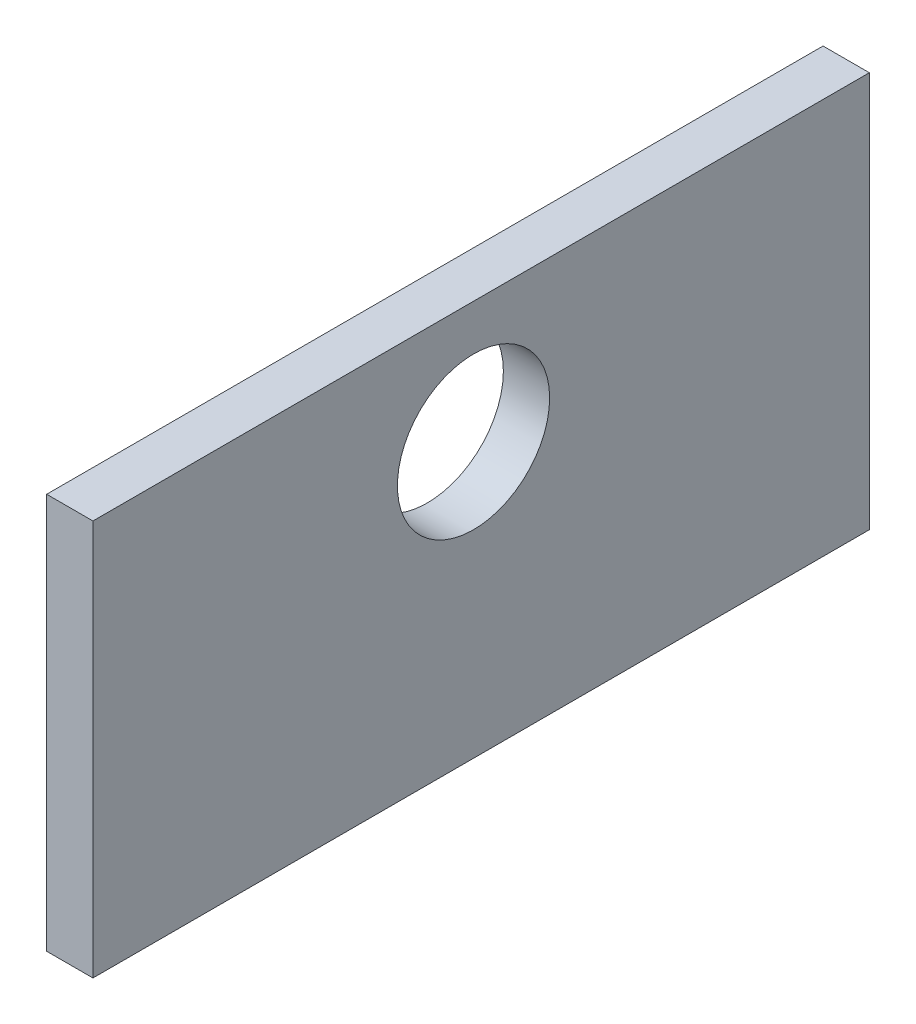
ISO-10303-21;
HEADER;
FILE_DESCRIPTION(('STEP AP214'),'2;1');
FILE_NAME('part.step','',(''),(''),'','','');
FILE_SCHEMA(('AUTOMOTIVE_DESIGN { 1 0 10303 214 1 1 1 1 }'));
ENDSEC;
DATA;
#1=APPLICATION_CONTEXT('core data for automotive mechanical design processes');
#2=APPLICATION_PROTOCOL_DEFINITION('international standard','automotive_design',2000,#1);
#3=PRODUCT_CONTEXT('',#1,'mechanical');
#4=PRODUCT('Part','Part','',(#3));
#5=PRODUCT_RELATED_PRODUCT_CATEGORY('part','',(#4));
#6=PRODUCT_DEFINITION_FORMATION('','',#4);
#7=PRODUCT_DEFINITION_CONTEXT('part definition',#1,'design');
#8=PRODUCT_DEFINITION('design','',#6,#7);
#9=PRODUCT_DEFINITION_SHAPE('','',#8);
#10=(LENGTH_UNIT() NAMED_UNIT(*) SI_UNIT(.MILLI.,.METRE.));
#11=(NAMED_UNIT(*) PLANE_ANGLE_UNIT() SI_UNIT($,.RADIAN.));
#12=(NAMED_UNIT(*) SI_UNIT($,.STERADIAN.) SOLID_ANGLE_UNIT());
#13=UNCERTAINTY_MEASURE_WITH_UNIT(LENGTH_MEASURE(1.E-05),#10,'distance_accuracy_value','');
#14=(GEOMETRIC_REPRESENTATION_CONTEXT(3) GLOBAL_UNCERTAINTY_ASSIGNED_CONTEXT((#13)) GLOBAL_UNIT_ASSIGNED_CONTEXT((#10,
#11,#12)) REPRESENTATION_CONTEXT('',''));
#15=CARTESIAN_POINT('',(0.,0.,0.));
#16=DIRECTION('',(0.,0.,1.));
#17=DIRECTION('',(1.,0.,0.));
#18=AXIS2_PLACEMENT_3D('',#15,#16,#17);
#19=CARTESIAN_POINT('',(4.826,0.,0.));
#20=DIRECTION('',(1.,0.,0.));
#21=DIRECTION('',(0.,0.,-1.));
#22=AXIS2_PLACEMENT_3D('',#19,#20,#21);
#23=PLANE('',#22);
#24=DIRECTION('',(0.,-1.,0.));
#25=VECTOR('',#24,1.);
#26=CARTESIAN_POINT('',(4.826,12.7,39.6875));
#27=LINE('',#26,#25);
#28=CARTESIAN_POINT('',(4.826,12.7,39.6875));
#29=VERTEX_POINT('',#28);
#30=CARTESIAN_POINT('',(4.826,-28.575,39.6875));
#31=VERTEX_POINT('',#30);
#32=EDGE_CURVE('E96',#29,#31,#27,.T.);
#33=ORIENTED_EDGE('',*,*,#32,.T.);
#34=DIRECTION('',(0.,0.,-1.));
#35=VECTOR('',#34,1.);
#36=CARTESIAN_POINT('',(4.826,-28.575,39.6875));
#37=LINE('',#36,#35);
#38=CARTESIAN_POINT('',(4.826,-28.575,-41.275));
#39=VERTEX_POINT('',#38);
#40=EDGE_CURVE('E91',#31,#39,#37,.T.);
#41=ORIENTED_EDGE('',*,*,#40,.T.);
#42=DIRECTION('',(0.,1.,0.));
#43=VECTOR('',#42,1.);
#44=CARTESIAN_POINT('',(4.826,12.7,-41.275));
#45=LINE('',#44,#43);
#46=CARTESIAN_POINT('',(4.826,12.7,-41.275));
#47=VERTEX_POINT('',#46);
#48=EDGE_CURVE('E94',#39,#47,#45,.T.);
#49=ORIENTED_EDGE('',*,*,#48,.T.);
#50=DIRECTION('',(0.,0.,1.));
#51=VECTOR('',#50,1.);
#52=CARTESIAN_POINT('',(4.826,12.7,39.6875));
#53=LINE('',#52,#51);
#54=EDGE_CURVE('E61',#47,#29,#53,.T.);
#55=ORIENTED_EDGE('',*,*,#54,.T.);
#56=EDGE_LOOP('',(#33,#41,#49,#55));
#57=FACE_BOUND('',#56,.T.);
#58=CARTESIAN_POINT('',(4.826,0.,0.));
#59=DIRECTION('',(1.,0.,0.));
#60=DIRECTION('',(0.,0.,-1.));
#61=AXIS2_PLACEMENT_3D('',#58,#59,#60);
#62=CIRCLE('',#61,7.9375);
#63=CARTESIAN_POINT('',(4.826,0.,-7.9375));
#64=VERTEX_POINT('',#63);
#65=EDGE_CURVE('E111',#64,#64,#62,.T.);
#66=ORIENTED_EDGE('',*,*,#65,.F.);
#67=EDGE_LOOP('',(#66));
#68=FACE_BOUND('',#67,.T.);
#69=ADVANCED_FACE('F44',(#57,#68),#23,.T.);
#70=CARTESIAN_POINT('',(0.,0.,0.));
#71=DIRECTION('',(1.,0.,0.));
#72=DIRECTION('',(0.,0.,-1.));
#73=AXIS2_PLACEMENT_3D('',#70,#71,#72);
#74=PLANE('',#73);
#75=DIRECTION('',(0.,-1.,0.));
#76=VECTOR('',#75,1.);
#77=CARTESIAN_POINT('',(0.,12.7,39.6875));
#78=LINE('',#77,#76);
#79=CARTESIAN_POINT('',(0.,12.7,39.6875));
#80=VERTEX_POINT('',#79);
#81=CARTESIAN_POINT('',(0.,-28.575,39.6875));
#82=VERTEX_POINT('',#81);
#83=EDGE_CURVE('E108',#80,#82,#78,.T.);
#84=ORIENTED_EDGE('',*,*,#83,.F.);
#85=DIRECTION('',(0.,0.,1.));
#86=VECTOR('',#85,1.);
#87=CARTESIAN_POINT('',(0.,12.7,39.6875));
#88=LINE('',#87,#86);
#89=CARTESIAN_POINT('',(0.,12.7,-41.275));
#90=VERTEX_POINT('',#89);
#91=EDGE_CURVE('E84',#90,#80,#88,.T.);
#92=ORIENTED_EDGE('',*,*,#91,.F.);
#93=DIRECTION('',(0.,1.,0.));
#94=VECTOR('',#93,1.);
#95=CARTESIAN_POINT('',(0.,12.7,-41.275));
#96=LINE('',#95,#94);
#97=CARTESIAN_POINT('',(0.,-28.575,-41.275));
#98=VERTEX_POINT('',#97);
#99=EDGE_CURVE('E78',#98,#90,#96,.T.);
#100=ORIENTED_EDGE('',*,*,#99,.F.);
#101=DIRECTION('',(0.,0.,-1.));
#102=VECTOR('',#101,1.);
#103=CARTESIAN_POINT('',(0.,-28.575,39.6875));
#104=LINE('',#103,#102);
#105=EDGE_CURVE('E100',#82,#98,#104,.T.);
#106=ORIENTED_EDGE('',*,*,#105,.F.);
#107=EDGE_LOOP('',(#84,#92,#100,#106));
#108=FACE_BOUND('',#107,.T.);
#109=CARTESIAN_POINT('',(0.,0.,0.));
#110=DIRECTION('',(1.,0.,0.));
#111=DIRECTION('',(0.,0.,-1.));
#112=AXIS2_PLACEMENT_3D('',#109,#110,#111);
#113=CIRCLE('',#112,7.9375);
#114=CARTESIAN_POINT('',(0.,0.,-7.9375));
#115=VERTEX_POINT('',#114);
#116=EDGE_CURVE('E123',#115,#115,#113,.T.);
#117=ORIENTED_EDGE('',*,*,#116,.T.);
#118=EDGE_LOOP('',(#117));
#119=FACE_BOUND('',#118,.T.);
#120=ADVANCED_FACE('F119',(#108,#119),#74,.F.);
#121=CARTESIAN_POINT('',(4.826,12.7,39.6875));
#122=DIRECTION('',(0.,0.,-1.));
#123=DIRECTION('',(0.,1.,0.));
#124=AXIS2_PLACEMENT_3D('',#121,#122,#123);
#125=PLANE('',#124);
#126=ORIENTED_EDGE('',*,*,#83,.T.);
#127=DIRECTION('',(-1.,0.,0.));
#128=VECTOR('',#127,1.);
#129=CARTESIAN_POINT('',(4.826,-28.575,39.6875));
#130=LINE('',#129,#128);
#131=EDGE_CURVE('E13',#31,#82,#130,.T.);
#132=ORIENTED_EDGE('',*,*,#131,.F.);
#133=ORIENTED_EDGE('',*,*,#32,.F.);
#134=DIRECTION('',(-1.,0.,0.));
#135=VECTOR('',#134,1.);
#136=CARTESIAN_POINT('',(4.826,12.7,39.6875));
#137=LINE('',#136,#135);
#138=EDGE_CURVE('E104',#29,#80,#137,.T.);
#139=ORIENTED_EDGE('',*,*,#138,.T.);
#140=EDGE_LOOP('',(#126,#132,#133,#139));
#141=FACE_BOUND('',#140,.T.);
#142=ADVANCED_FACE('F46',(#141),#125,.F.);
#143=CARTESIAN_POINT('',(4.826,-28.575,39.6875));
#144=DIRECTION('',(0.,1.,0.));
#145=DIRECTION('',(0.,0.,1.));
#146=AXIS2_PLACEMENT_3D('',#143,#144,#145);
#147=PLANE('',#146);
#148=ORIENTED_EDGE('',*,*,#105,.T.);
#149=DIRECTION('',(-1.,0.,0.));
#150=VECTOR('',#149,1.);
#151=CARTESIAN_POINT('',(4.826,-28.575,-41.275));
#152=LINE('',#151,#150);
#153=EDGE_CURVE('E53',#39,#98,#152,.T.);
#154=ORIENTED_EDGE('',*,*,#153,.F.);
#155=ORIENTED_EDGE('',*,*,#40,.F.);
#156=ORIENTED_EDGE('',*,*,#131,.T.);
#157=EDGE_LOOP('',(#148,#154,#155,#156));
#158=FACE_BOUND('',#157,.T.);
#159=ADVANCED_FACE('F99',(#158),#147,.F.);
#160=CARTESIAN_POINT('',(4.826,12.7,-41.275));
#161=DIRECTION('',(0.,0.,1.));
#162=DIRECTION('',(0.,-1.,0.));
#163=AXIS2_PLACEMENT_3D('',#160,#161,#162);
#164=PLANE('',#163);
#165=ORIENTED_EDGE('',*,*,#99,.T.);
#166=DIRECTION('',(-1.,0.,0.));
#167=VECTOR('',#166,1.);
#168=CARTESIAN_POINT('',(4.826,12.7,-41.275));
#169=LINE('',#168,#167);
#170=EDGE_CURVE('E101',#47,#90,#169,.T.);
#171=ORIENTED_EDGE('',*,*,#170,.F.);
#172=ORIENTED_EDGE('',*,*,#48,.F.);
#173=ORIENTED_EDGE('',*,*,#153,.T.);
#174=EDGE_LOOP('',(#165,#171,#172,#173));
#175=FACE_BOUND('',#174,.T.);
#176=ADVANCED_FACE('F102',(#175),#164,.F.);
#177=CARTESIAN_POINT('',(4.826,12.7,39.6875));
#178=DIRECTION('',(0.,-1.,0.));
#179=DIRECTION('',(0.,0.,-1.));
#180=AXIS2_PLACEMENT_3D('',#177,#178,#179);
#181=PLANE('',#180);
#182=ORIENTED_EDGE('',*,*,#91,.T.);
#183=ORIENTED_EDGE('',*,*,#138,.F.);
#184=ORIENTED_EDGE('',*,*,#54,.F.);
#185=ORIENTED_EDGE('',*,*,#170,.T.);
#186=EDGE_LOOP('',(#182,#183,#184,#185));
#187=FACE_BOUND('',#186,.T.);
#188=ADVANCED_FACE('F116',(#187),#181,.F.);
#189=CARTESIAN_POINT('',(4.826,0.,0.));
#190=DIRECTION('',(-1.,0.,0.));
#191=DIRECTION('',(0.,0.,1.));
#192=AXIS2_PLACEMENT_3D('',#189,#190,#191);
#193=CYLINDRICAL_SURFACE('',#192,7.9375);
#194=ORIENTED_EDGE('',*,*,#65,.T.);
#195=EDGE_LOOP('',(#194));
#196=FACE_BOUND('',#195,.T.);
#197=ORIENTED_EDGE('',*,*,#116,.F.);
#198=EDGE_LOOP('',(#197));
#199=FACE_BOUND('',#198,.T.);
#200=ADVANCED_FACE('F129',(#196,#199),#193,.F.);
#201=CLOSED_SHELL('',(#69,#120,#142,#159,#176,#188,#200));
#202=MANIFOLD_SOLID_BREP('B2',#201);
#203=ADVANCED_BREP_SHAPE_REPRESENTATION('',(#18,#202),#14);
#204=SHAPE_DEFINITION_REPRESENTATION(#9,#203);
ENDSEC;
END-ISO-10303-21;
